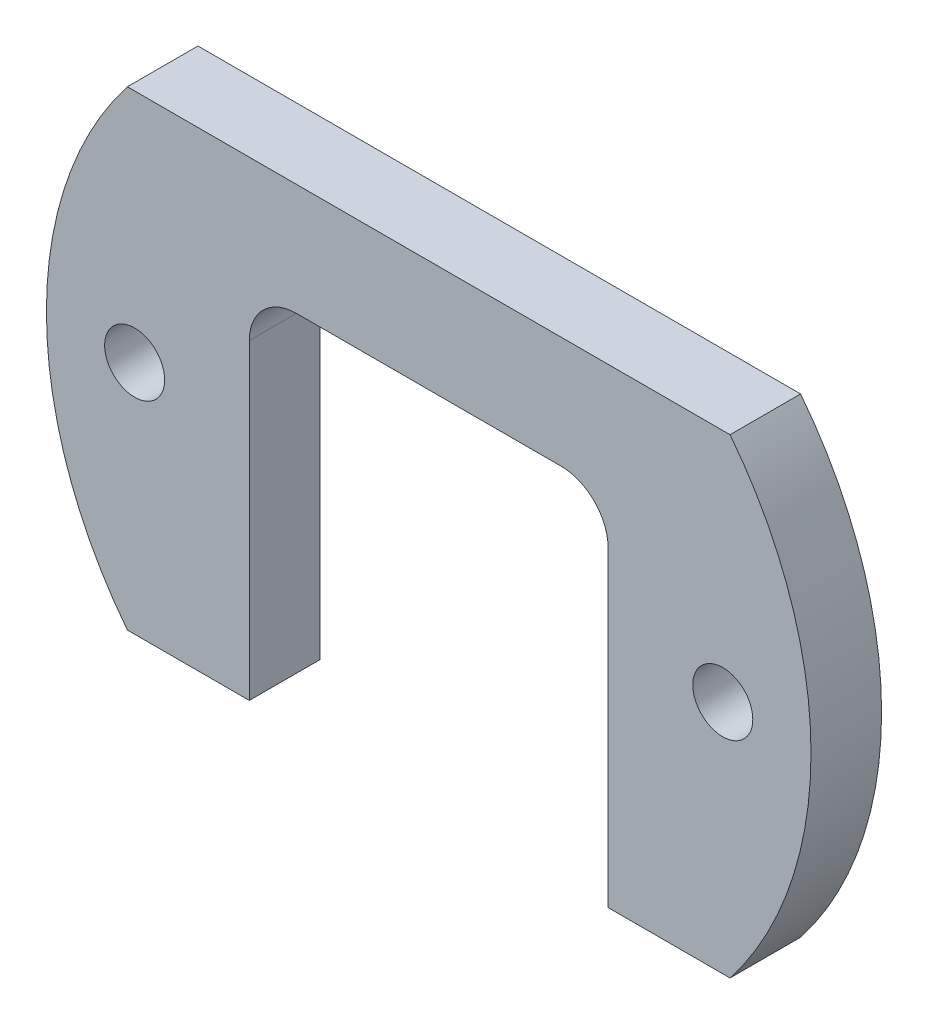
ISO-10303-21;
HEADER;
FILE_DESCRIPTION(('STEP AP214'),'2;1');
FILE_NAME('part.step','',(''),(''),'','','');
FILE_SCHEMA(('AUTOMOTIVE_DESIGN { 1 0 10303 214 1 1 1 1 }'));
ENDSEC;
DATA;
#1=APPLICATION_CONTEXT('core data for automotive mechanical design processes');
#2=APPLICATION_PROTOCOL_DEFINITION('international standard','automotive_design',2000,#1);
#3=PRODUCT_CONTEXT('',#1,'mechanical');
#4=PRODUCT('Part','Part','',(#3));
#5=PRODUCT_RELATED_PRODUCT_CATEGORY('part','',(#4));
#6=PRODUCT_DEFINITION_FORMATION('','',#4);
#7=PRODUCT_DEFINITION_CONTEXT('part definition',#1,'design');
#8=PRODUCT_DEFINITION('design','',#6,#7);
#9=PRODUCT_DEFINITION_SHAPE('','',#8);
#10=(LENGTH_UNIT() NAMED_UNIT(*) SI_UNIT(.MILLI.,.METRE.));
#11=(NAMED_UNIT(*) PLANE_ANGLE_UNIT() SI_UNIT($,.RADIAN.));
#12=(NAMED_UNIT(*) SI_UNIT($,.STERADIAN.) SOLID_ANGLE_UNIT());
#13=UNCERTAINTY_MEASURE_WITH_UNIT(LENGTH_MEASURE(1.E-05),#10,'distance_accuracy_value','');
#14=(GEOMETRIC_REPRESENTATION_CONTEXT(3) GLOBAL_UNCERTAINTY_ASSIGNED_CONTEXT((#13)) GLOBAL_UNIT_ASSIGNED_CONTEXT((#10,
#11,#12)) REPRESENTATION_CONTEXT('',''));
#15=CARTESIAN_POINT('',(0.,0.,0.));
#16=DIRECTION('',(0.,0.,1.));
#17=DIRECTION('',(1.,0.,0.));
#18=AXIS2_PLACEMENT_3D('',#15,#16,#17);
#19=CARTESIAN_POINT('',(30.5,61.0000000000001,12.));
#20=DIRECTION('',(1.,0.,0.));
#21=DIRECTION('',(0.,1.,0.));
#22=AXIS2_PLACEMENT_3D('',#19,#20,#21);
#23=PLANE('',#22);
#24=DIRECTION('',(0.,-1.,0.));
#25=VECTOR('',#24,1.);
#26=CARTESIAN_POINT('',(30.5,61.0000000000001,12.));
#27=LINE('',#26,#25);
#28=CARTESIAN_POINT('',(30.5,53.,12.));
#29=VERTEX_POINT('',#28);
#30=CARTESIAN_POINT('',(30.4999999999998,0.,12.));
#31=VERTEX_POINT('',#30);
#32=EDGE_CURVE('E112',#29,#31,#27,.T.);
#33=ORIENTED_EDGE('',*,*,#32,.F.);
#34=DIRECTION('',(0.,0.,-1.));
#35=VECTOR('',#34,1.);
#36=CARTESIAN_POINT('',(30.5,53.,0.));
#37=LINE('',#36,#35);
#38=CARTESIAN_POINT('',(30.5,53.,0.));
#39=VERTEX_POINT('',#38);
#40=EDGE_CURVE('E138',#29,#39,#37,.T.);
#41=ORIENTED_EDGE('',*,*,#40,.T.);
#42=DIRECTION('',(0.,-1.,0.));
#43=VECTOR('',#42,1.);
#44=CARTESIAN_POINT('',(30.5,61.0000000000001,0.));
#45=LINE('',#44,#43);
#46=CARTESIAN_POINT('',(30.4999999999998,0.,0.));
#47=VERTEX_POINT('',#46);
#48=EDGE_CURVE('E136',#39,#47,#45,.T.);
#49=ORIENTED_EDGE('',*,*,#48,.T.);
#50=DIRECTION('',(0.,0.,-1.));
#51=VECTOR('',#50,1.);
#52=CARTESIAN_POINT('',(30.4999999999998,0.,12.));
#53=LINE('',#52,#51);
#54=EDGE_CURVE('E129',#31,#47,#53,.T.);
#55=ORIENTED_EDGE('',*,*,#54,.F.);
#56=EDGE_LOOP('',(#33,#41,#49,#55));
#57=FACE_BOUND('',#56,.T.);
#58=ADVANCED_FACE('F36',(#57),#23,.F.);
#59=CARTESIAN_POINT('',(30.4999999999998,0.,12.));
#60=DIRECTION('',(0.,1.,0.));
#61=DIRECTION('',(-1.,0.,0.));
#62=AXIS2_PLACEMENT_3D('',#59,#60,#61);
#63=PLANE('',#62);
#64=DIRECTION('',(1.,0.,0.));
#65=VECTOR('',#64,1.);
#66=CARTESIAN_POINT('',(30.4999999999998,0.,0.));
#67=LINE('',#66,#65);
#68=CARTESIAN_POINT('',(51.2347538297978,1.11022302462516E-13,0.));
#69=VERTEX_POINT('',#68);
#70=EDGE_CURVE('E242',#47,#69,#67,.T.);
#71=ORIENTED_EDGE('',*,*,#70,.T.);
#72=DIRECTION('',(0.,0.,-1.));
#73=VECTOR('',#72,1.);
#74=CARTESIAN_POINT('',(51.2347538297978,1.11022302462516E-13,12.));
#75=LINE('',#74,#73);
#76=CARTESIAN_POINT('',(51.2347538297978,1.11022302462516E-13,12.));
#77=VERTEX_POINT('',#76);
#78=EDGE_CURVE('E131',#77,#69,#75,.T.);
#79=ORIENTED_EDGE('',*,*,#78,.F.);
#80=DIRECTION('',(1.,0.,0.));
#81=VECTOR('',#80,1.);
#82=CARTESIAN_POINT('',(30.4999999999998,0.,12.));
#83=LINE('',#82,#81);
#84=EDGE_CURVE('E116',#31,#77,#83,.T.);
#85=ORIENTED_EDGE('',*,*,#84,.F.);
#86=ORIENTED_EDGE('',*,*,#54,.T.);
#87=EDGE_LOOP('',(#71,#79,#85,#86));
#88=FACE_BOUND('',#87,.T.);
#89=ADVANCED_FACE('F128',(#88),#63,.F.);
#90=CARTESIAN_POINT('',(0.,40.,12.));
#91=DIRECTION('',(0.,0.,-1.));
#92=DIRECTION('',(-1.,0.,0.));
#93=AXIS2_PLACEMENT_3D('',#90,#91,#92);
#94=CYLINDRICAL_SURFACE('',#93,65.);
#95=CARTESIAN_POINT('',(0.,40.,0.));
#96=DIRECTION('',(0.,0.,1.));
#97=DIRECTION('',(1.,0.,0.));
#98=AXIS2_PLACEMENT_3D('',#95,#96,#97);
#99=CIRCLE('',#98,65.);
#100=CARTESIAN_POINT('',(51.2347538297978,80.,0.));
#101=VERTEX_POINT('',#100);
#102=EDGE_CURVE('E244',#69,#101,#99,.T.);
#103=ORIENTED_EDGE('',*,*,#102,.T.);
#104=DIRECTION('',(0.,0.,-1.));
#105=VECTOR('',#104,1.);
#106=CARTESIAN_POINT('',(51.2347538297978,80.0000000000001,12.));
#107=LINE('',#106,#105);
#108=CARTESIAN_POINT('',(51.2347538297978,80.0000000000001,12.));
#109=VERTEX_POINT('',#108);
#110=EDGE_CURVE('E142',#109,#101,#107,.T.);
#111=ORIENTED_EDGE('',*,*,#110,.F.);
#112=CARTESIAN_POINT('',(0.,40.,12.));
#113=DIRECTION('',(0.,0.,1.));
#114=DIRECTION('',(1.,0.,0.));
#115=AXIS2_PLACEMENT_3D('',#112,#113,#114);
#116=CIRCLE('',#115,65.);
#117=EDGE_CURVE('E133',#77,#109,#116,.T.);
#118=ORIENTED_EDGE('',*,*,#117,.F.);
#119=ORIENTED_EDGE('',*,*,#78,.T.);
#120=EDGE_LOOP('',(#103,#111,#118,#119));
#121=FACE_BOUND('',#120,.T.);
#122=ADVANCED_FACE('F187',(#121),#94,.T.);
#123=CARTESIAN_POINT('',(0.,80.,12.));
#124=DIRECTION('',(0.,-1.,0.));
#125=DIRECTION('',(1.,0.,0.));
#126=AXIS2_PLACEMENT_3D('',#123,#124,#125);
#127=PLANE('',#126);
#128=DIRECTION('',(-1.,0.,0.));
#129=VECTOR('',#128,1.);
#130=CARTESIAN_POINT('',(0.,80.,0.));
#131=LINE('',#130,#129);
#132=CARTESIAN_POINT('',(-51.234753829798,80.,0.));
#133=VERTEX_POINT('',#132);
#134=EDGE_CURVE('E247',#101,#133,#131,.T.);
#135=ORIENTED_EDGE('',*,*,#134,.T.);
#136=DIRECTION('',(0.,0.,-1.));
#137=VECTOR('',#136,1.);
#138=CARTESIAN_POINT('',(-51.234753829798,80.,12.));
#139=LINE('',#138,#137);
#140=CARTESIAN_POINT('',(-51.234753829798,80.,12.));
#141=VERTEX_POINT('',#140);
#142=EDGE_CURVE('E259',#141,#133,#139,.T.);
#143=ORIENTED_EDGE('',*,*,#142,.F.);
#144=DIRECTION('',(-1.,0.,0.));
#145=VECTOR('',#144,1.);
#146=CARTESIAN_POINT('',(0.,80.,12.));
#147=LINE('',#146,#145);
#148=EDGE_CURVE('E230',#109,#141,#147,.T.);
#149=ORIENTED_EDGE('',*,*,#148,.F.);
#150=ORIENTED_EDGE('',*,*,#110,.T.);
#151=EDGE_LOOP('',(#135,#143,#149,#150));
#152=FACE_BOUND('',#151,.T.);
#153=ADVANCED_FACE('F192',(#152),#127,.F.);
#154=CARTESIAN_POINT('',(0.,40.,12.));
#155=DIRECTION('',(0.,0.,-1.));
#156=DIRECTION('',(-1.,0.,0.));
#157=AXIS2_PLACEMENT_3D('',#154,#155,#156);
#158=CYLINDRICAL_SURFACE('',#157,65.);
#159=CARTESIAN_POINT('',(0.,40.,0.));
#160=DIRECTION('',(0.,0.,1.));
#161=DIRECTION('',(1.,0.,0.));
#162=AXIS2_PLACEMENT_3D('',#159,#160,#161);
#163=CIRCLE('',#162,65.);
#164=CARTESIAN_POINT('',(-51.234753829798,-1.11022302462516E-13,0.));
#165=VERTEX_POINT('',#164);
#166=EDGE_CURVE('E249',#133,#165,#163,.T.);
#167=ORIENTED_EDGE('',*,*,#166,.T.);
#168=DIRECTION('',(0.,0.,-1.));
#169=VECTOR('',#168,1.);
#170=CARTESIAN_POINT('',(-51.234753829798,-1.11022302462516E-13,12.));
#171=LINE('',#170,#169);
#172=CARTESIAN_POINT('',(-51.234753829798,-1.11022302462516E-13,12.));
#173=VERTEX_POINT('',#172);
#174=EDGE_CURVE('E256',#173,#165,#171,.T.);
#175=ORIENTED_EDGE('',*,*,#174,.F.);
#176=CARTESIAN_POINT('',(0.,40.,12.));
#177=DIRECTION('',(0.,0.,1.));
#178=DIRECTION('',(1.,0.,0.));
#179=AXIS2_PLACEMENT_3D('',#176,#177,#178);
#180=CIRCLE('',#179,65.);
#181=EDGE_CURVE('E232',#141,#173,#180,.T.);
#182=ORIENTED_EDGE('',*,*,#181,.F.);
#183=ORIENTED_EDGE('',*,*,#142,.T.);
#184=EDGE_LOOP('',(#167,#175,#182,#183));
#185=FACE_BOUND('',#184,.T.);
#186=ADVANCED_FACE('F196',(#185),#158,.T.);
#187=CARTESIAN_POINT('',(-30.5,0.,12.));
#188=DIRECTION('',(0.,1.,0.));
#189=DIRECTION('',(0.,0.,1.));
#190=AXIS2_PLACEMENT_3D('',#187,#188,#189);
#191=PLANE('',#190);
#192=DIRECTION('',(1.,0.,0.));
#193=VECTOR('',#192,1.);
#194=CARTESIAN_POINT('',(-30.5,0.,0.));
#195=LINE('',#194,#193);
#196=CARTESIAN_POINT('',(-30.5,0.,0.));
#197=VERTEX_POINT('',#196);
#198=EDGE_CURVE('E251',#165,#197,#195,.T.);
#199=ORIENTED_EDGE('',*,*,#198,.T.);
#200=DIRECTION('',(0.,0.,-1.));
#201=VECTOR('',#200,1.);
#202=CARTESIAN_POINT('',(-30.5,0.,12.));
#203=LINE('',#202,#201);
#204=CARTESIAN_POINT('',(-30.5,0.,12.));
#205=VERTEX_POINT('',#204);
#206=EDGE_CURVE('E240',#205,#197,#203,.T.);
#207=ORIENTED_EDGE('',*,*,#206,.F.);
#208=DIRECTION('',(1.,0.,0.));
#209=VECTOR('',#208,1.);
#210=CARTESIAN_POINT('',(-30.5,0.,12.));
#211=LINE('',#210,#209);
#212=EDGE_CURVE('E234',#173,#205,#211,.T.);
#213=ORIENTED_EDGE('',*,*,#212,.F.);
#214=ORIENTED_EDGE('',*,*,#174,.T.);
#215=EDGE_LOOP('',(#199,#207,#213,#214));
#216=FACE_BOUND('',#215,.T.);
#217=ADVANCED_FACE('F200',(#216),#191,.F.);
#218=CARTESIAN_POINT('',(-30.5,60.9999999999999,12.));
#219=DIRECTION('',(-1.,0.,0.));
#220=DIRECTION('',(0.,-1.,0.));
#221=AXIS2_PLACEMENT_3D('',#218,#219,#220);
#222=PLANE('',#221);
#223=DIRECTION('',(0.,1.,0.));
#224=VECTOR('',#223,1.);
#225=CARTESIAN_POINT('',(-30.5,60.9999999999999,0.));
#226=LINE('',#225,#224);
#227=CARTESIAN_POINT('',(-30.5000000000003,52.9999999999999,0.));
#228=VERTEX_POINT('',#227);
#229=EDGE_CURVE('E169',#197,#228,#226,.T.);
#230=ORIENTED_EDGE('',*,*,#229,.T.);
#231=DIRECTION('',(0.,0.,-1.));
#232=VECTOR('',#231,1.);
#233=CARTESIAN_POINT('',(-30.5000000000003,52.9999999999999,12.));
#234=LINE('',#233,#232);
#235=CARTESIAN_POINT('',(-30.5000000000003,52.9999999999999,12.));
#236=VERTEX_POINT('',#235);
#237=EDGE_CURVE('E51',#228,#236,#234,.F.);
#238=ORIENTED_EDGE('',*,*,#237,.T.);
#239=DIRECTION('',(0.,1.,0.));
#240=VECTOR('',#239,1.);
#241=CARTESIAN_POINT('',(-30.5,60.9999999999999,12.));
#242=LINE('',#241,#240);
#243=EDGE_CURVE('E236',#205,#236,#242,.T.);
#244=ORIENTED_EDGE('',*,*,#243,.F.);
#245=ORIENTED_EDGE('',*,*,#206,.T.);
#246=EDGE_LOOP('',(#230,#238,#244,#245));
#247=FACE_BOUND('',#246,.T.);
#248=ADVANCED_FACE('F204',(#247),#222,.F.);
#249=CARTESIAN_POINT('',(-30.5,60.9999999999999,12.));
#250=DIRECTION('',(0.,1.,0.));
#251=DIRECTION('',(0.,0.,1.));
#252=AXIS2_PLACEMENT_3D('',#249,#250,#251);
#253=PLANE('',#252);
#254=DIRECTION('',(1.,0.,0.));
#255=VECTOR('',#254,1.);
#256=CARTESIAN_POINT('',(-30.5,60.9999999999999,0.));
#257=LINE('',#256,#255);
#258=CARTESIAN_POINT('',(-22.5,60.9999999999999,0.));
#259=VERTEX_POINT('',#258);
#260=CARTESIAN_POINT('',(22.5,61.0000000000001,0.));
#261=VERTEX_POINT('',#260);
#262=EDGE_CURVE('E124',#259,#261,#257,.T.);
#263=ORIENTED_EDGE('',*,*,#262,.T.);
#264=DIRECTION('',(0.,0.,-1.));
#265=VECTOR('',#264,1.);
#266=CARTESIAN_POINT('',(22.5,61.0000000000001,12.));
#267=LINE('',#266,#265);
#268=CARTESIAN_POINT('',(22.5,61.0000000000001,12.));
#269=VERTEX_POINT('',#268);
#270=EDGE_CURVE('E156',#261,#269,#267,.F.);
#271=ORIENTED_EDGE('',*,*,#270,.T.);
#272=DIRECTION('',(1.,0.,0.));
#273=VECTOR('',#272,1.);
#274=CARTESIAN_POINT('',(-30.5,60.9999999999999,12.));
#275=LINE('',#274,#273);
#276=CARTESIAN_POINT('',(-22.5,60.9999999999999,12.));
#277=VERTEX_POINT('',#276);
#278=EDGE_CURVE('E238',#277,#269,#275,.T.);
#279=ORIENTED_EDGE('',*,*,#278,.F.);
#280=DIRECTION('',(0.,0.,-1.));
#281=VECTOR('',#280,1.);
#282=CARTESIAN_POINT('',(-22.5,60.9999999999999,0.));
#283=LINE('',#282,#281);
#284=EDGE_CURVE('E140',#277,#259,#283,.T.);
#285=ORIENTED_EDGE('',*,*,#284,.T.);
#286=EDGE_LOOP('',(#263,#271,#279,#285));
#287=FACE_BOUND('',#286,.T.);
#288=ADVANCED_FACE('F166',(#287),#253,.F.);
#289=CARTESIAN_POINT('',(0.,40.,12.));
#290=DIRECTION('',(0.,0.,1.));
#291=DIRECTION('',(1.,0.,0.));
#292=AXIS2_PLACEMENT_3D('',#289,#290,#291);
#293=PLANE('',#292);
#294=CARTESIAN_POINT('',(-50.,40.0000000000006,12.));
#295=DIRECTION('',(0.,0.,1.));
#296=DIRECTION('',(1.,0.,0.));
#297=AXIS2_PLACEMENT_3D('',#294,#295,#296);
#298=CIRCLE('',#297,5.09999999999999);
#299=CARTESIAN_POINT('',(-44.9000000000001,40.0000000000006,12.));
#300=VERTEX_POINT('',#299);
#301=EDGE_CURVE('E152',#300,#300,#298,.T.);
#302=ORIENTED_EDGE('',*,*,#301,.F.);
#303=EDGE_LOOP('',(#302));
#304=FACE_BOUND('',#303,.T.);
#305=CARTESIAN_POINT('',(49.9999999999999,40.,12.));
#306=DIRECTION('',(0.,0.,1.));
#307=DIRECTION('',(1.,0.,0.));
#308=AXIS2_PLACEMENT_3D('',#305,#306,#307);
#309=CIRCLE('',#308,5.09999999999999);
#310=CARTESIAN_POINT('',(55.0999999999998,40.,12.));
#311=VERTEX_POINT('',#310);
#312=EDGE_CURVE('E149',#311,#311,#309,.T.);
#313=ORIENTED_EDGE('',*,*,#312,.F.);
#314=EDGE_LOOP('',(#313));
#315=FACE_BOUND('',#314,.T.);
#316=ORIENTED_EDGE('',*,*,#278,.T.);
#317=CARTESIAN_POINT('',(22.5,53.,12.));
#318=DIRECTION('',(0.,0.,1.));
#319=DIRECTION('',(1.,0.,0.));
#320=AXIS2_PLACEMENT_3D('',#317,#318,#319);
#321=CIRCLE('',#320,8.);
#322=EDGE_CURVE('E119',#269,#29,#321,.F.);
#323=ORIENTED_EDGE('',*,*,#322,.T.);
#324=ORIENTED_EDGE('',*,*,#32,.T.);
#325=ORIENTED_EDGE('',*,*,#84,.T.);
#326=ORIENTED_EDGE('',*,*,#117,.T.);
#327=ORIENTED_EDGE('',*,*,#148,.T.);
#328=ORIENTED_EDGE('',*,*,#181,.T.);
#329=ORIENTED_EDGE('',*,*,#212,.T.);
#330=ORIENTED_EDGE('',*,*,#243,.T.);
#331=CARTESIAN_POINT('',(-22.5000000000003,52.9999999999999,12.));
#332=DIRECTION('',(0.,0.,1.));
#333=DIRECTION('',(1.,0.,0.));
#334=AXIS2_PLACEMENT_3D('',#331,#332,#333);
#335=CIRCLE('',#334,8.);
#336=EDGE_CURVE('E11',#236,#277,#335,.F.);
#337=ORIENTED_EDGE('',*,*,#336,.T.);
#338=EDGE_LOOP('',(#316,#323,#324,#325,#326,#327,#328,#329,#330,#337));
#339=FACE_BOUND('',#338,.T.);
#340=ADVANCED_FACE('F115',(#304,#315,#339),#293,.T.);
#341=CARTESIAN_POINT('',(0.,40.,0.));
#342=DIRECTION('',(0.,0.,1.));
#343=DIRECTION('',(1.,0.,0.));
#344=AXIS2_PLACEMENT_3D('',#341,#342,#343);
#345=PLANE('',#344);
#346=CARTESIAN_POINT('',(-50.,40.0000000000006,0.));
#347=DIRECTION('',(0.,0.,1.));
#348=DIRECTION('',(1.,0.,0.));
#349=AXIS2_PLACEMENT_3D('',#346,#347,#348);
#350=CIRCLE('',#349,5.09999999999999);
#351=CARTESIAN_POINT('',(-44.9000000000001,40.0000000000006,0.));
#352=VERTEX_POINT('',#351);
#353=EDGE_CURVE('E150',#352,#352,#350,.T.);
#354=ORIENTED_EDGE('',*,*,#353,.T.);
#355=EDGE_LOOP('',(#354));
#356=FACE_BOUND('',#355,.T.);
#357=CARTESIAN_POINT('',(49.9999999999999,40.,0.));
#358=DIRECTION('',(0.,0.,1.));
#359=DIRECTION('',(1.,0.,0.));
#360=AXIS2_PLACEMENT_3D('',#357,#358,#359);
#361=CIRCLE('',#360,5.09999999999999);
#362=CARTESIAN_POINT('',(55.0999999999998,40.,0.));
#363=VERTEX_POINT('',#362);
#364=EDGE_CURVE('E146',#363,#363,#361,.T.);
#365=ORIENTED_EDGE('',*,*,#364,.T.);
#366=EDGE_LOOP('',(#365));
#367=FACE_BOUND('',#366,.T.);
#368=ORIENTED_EDGE('',*,*,#48,.F.);
#369=CARTESIAN_POINT('',(22.5,53.,0.));
#370=DIRECTION('',(0.,0.,1.));
#371=DIRECTION('',(1.,0.,0.));
#372=AXIS2_PLACEMENT_3D('',#369,#370,#371);
#373=CIRCLE('',#372,8.);
#374=EDGE_CURVE('E159',#39,#261,#373,.T.);
#375=ORIENTED_EDGE('',*,*,#374,.T.);
#376=ORIENTED_EDGE('',*,*,#262,.F.);
#377=CARTESIAN_POINT('',(-22.5000000000003,52.9999999999999,0.));
#378=DIRECTION('',(0.,0.,1.));
#379=DIRECTION('',(1.,0.,0.));
#380=AXIS2_PLACEMENT_3D('',#377,#378,#379);
#381=CIRCLE('',#380,8.);
#382=EDGE_CURVE('E44',#259,#228,#381,.T.);
#383=ORIENTED_EDGE('',*,*,#382,.T.);
#384=ORIENTED_EDGE('',*,*,#229,.F.);
#385=ORIENTED_EDGE('',*,*,#198,.F.);
#386=ORIENTED_EDGE('',*,*,#166,.F.);
#387=ORIENTED_EDGE('',*,*,#134,.F.);
#388=ORIENTED_EDGE('',*,*,#102,.F.);
#389=ORIENTED_EDGE('',*,*,#70,.F.);
#390=EDGE_LOOP('',(#368,#375,#376,#383,#384,#385,#386,#387,#388,#389));
#391=FACE_BOUND('',#390,.T.);
#392=ADVANCED_FACE('F162',(#356,#367,#391),#345,.F.);
#393=CARTESIAN_POINT('',(49.9999999999999,40.,12.));
#394=DIRECTION('',(0.,0.,1.));
#395=DIRECTION('',(1.,0.,0.));
#396=AXIS2_PLACEMENT_3D('',#393,#394,#395);
#397=CYLINDRICAL_SURFACE('',#396,5.09999999999999);
#398=ORIENTED_EDGE('',*,*,#312,.T.);
#399=EDGE_LOOP('',(#398));
#400=FACE_BOUND('',#399,.T.);
#401=ORIENTED_EDGE('',*,*,#364,.F.);
#402=EDGE_LOOP('',(#401));
#403=FACE_BOUND('',#402,.T.);
#404=ADVANCED_FACE('F179',(#400,#403),#397,.F.);
#405=CARTESIAN_POINT('',(-50.,40.0000000000006,12.));
#406=DIRECTION('',(0.,0.,1.));
#407=DIRECTION('',(1.,0.,0.));
#408=AXIS2_PLACEMENT_3D('',#405,#406,#407);
#409=CYLINDRICAL_SURFACE('',#408,5.09999999999999);
#410=ORIENTED_EDGE('',*,*,#301,.T.);
#411=EDGE_LOOP('',(#410));
#412=FACE_BOUND('',#411,.T.);
#413=ORIENTED_EDGE('',*,*,#353,.F.);
#414=EDGE_LOOP('',(#413));
#415=FACE_BOUND('',#414,.T.);
#416=ADVANCED_FACE('F173',(#412,#415),#409,.F.);
#417=CARTESIAN_POINT('',(22.5,53.,12.));
#418=DIRECTION('',(0.,0.,1.));
#419=DIRECTION('',(1.,0.,0.));
#420=AXIS2_PLACEMENT_3D('',#417,#418,#419);
#421=CYLINDRICAL_SURFACE('',#420,8.);
#422=ORIENTED_EDGE('',*,*,#322,.F.);
#423=ORIENTED_EDGE('',*,*,#270,.F.);
#424=ORIENTED_EDGE('',*,*,#374,.F.);
#425=ORIENTED_EDGE('',*,*,#40,.F.);
#426=EDGE_LOOP('',(#422,#423,#424,#425));
#427=FACE_BOUND('',#426,.T.);
#428=ADVANCED_FACE('F171',(#427),#421,.F.);
#429=CARTESIAN_POINT('',(-22.5000000000003,52.9999999999999,12.));
#430=DIRECTION('',(0.,0.,1.));
#431=DIRECTION('',(1.,0.,0.));
#432=AXIS2_PLACEMENT_3D('',#429,#430,#431);
#433=CYLINDRICAL_SURFACE('',#432,8.);
#434=ORIENTED_EDGE('',*,*,#336,.F.);
#435=ORIENTED_EDGE('',*,*,#237,.F.);
#436=ORIENTED_EDGE('',*,*,#382,.F.);
#437=ORIENTED_EDGE('',*,*,#284,.F.);
#438=EDGE_LOOP('',(#434,#435,#436,#437));
#439=FACE_BOUND('',#438,.T.);
#440=ADVANCED_FACE('F38',(#439),#433,.F.);
#441=CLOSED_SHELL('',(#58,#89,#122,#153,#186,#217,#248,#288,#340,#392,#404,#416,#428,#440));
#442=MANIFOLD_SOLID_BREP('B2',#441);
#443=ADVANCED_BREP_SHAPE_REPRESENTATION('',(#18,#442),#14);
#444=SHAPE_DEFINITION_REPRESENTATION(#9,#443);
ENDSEC;
END-ISO-10303-21;
